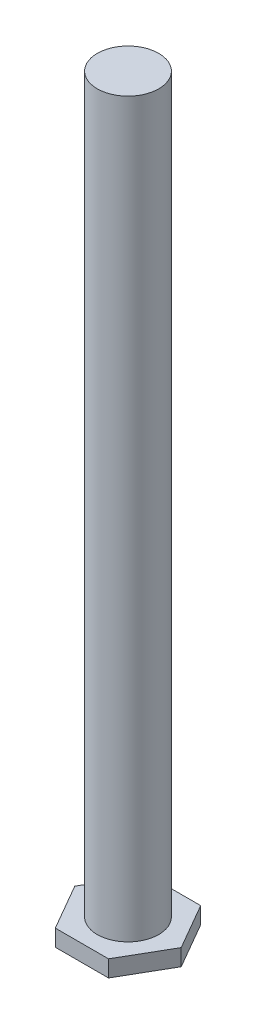
ISO-10303-21;
HEADER;
FILE_DESCRIPTION(('STEP AP214'),'2;1');
FILE_NAME('part.step','',(''),(''),'','','');
FILE_SCHEMA(('AUTOMOTIVE_DESIGN { 1 0 10303 214 1 1 1 1 }'));
ENDSEC;
DATA;
#1=APPLICATION_CONTEXT('core data for automotive mechanical design processes');
#2=APPLICATION_PROTOCOL_DEFINITION('international standard','automotive_design',2000,#1);
#3=PRODUCT_CONTEXT('',#1,'mechanical');
#4=PRODUCT('Part','Part','',(#3));
#5=PRODUCT_RELATED_PRODUCT_CATEGORY('part','',(#4));
#6=PRODUCT_DEFINITION_FORMATION('','',#4);
#7=PRODUCT_DEFINITION_CONTEXT('part definition',#1,'design');
#8=PRODUCT_DEFINITION('design','',#6,#7);
#9=PRODUCT_DEFINITION_SHAPE('','',#8);
#10=(LENGTH_UNIT() NAMED_UNIT(*) SI_UNIT(.MILLI.,.METRE.));
#11=(NAMED_UNIT(*) PLANE_ANGLE_UNIT() SI_UNIT($,.RADIAN.));
#12=(NAMED_UNIT(*) SI_UNIT($,.STERADIAN.) SOLID_ANGLE_UNIT());
#13=UNCERTAINTY_MEASURE_WITH_UNIT(LENGTH_MEASURE(1.E-05),#10,'distance_accuracy_value','');
#14=(GEOMETRIC_REPRESENTATION_CONTEXT(3) GLOBAL_UNCERTAINTY_ASSIGNED_CONTEXT((#13)) GLOBAL_UNIT_ASSIGNED_CONTEXT((#10,
#11,#12)) REPRESENTATION_CONTEXT('',''));
#15=CARTESIAN_POINT('',(0.,0.,0.));
#16=DIRECTION('',(0.,0.,1.));
#17=DIRECTION('',(1.,0.,0.));
#18=AXIS2_PLACEMENT_3D('',#15,#16,#17);
#19=CARTESIAN_POINT('',(-18.6032154166082,114.5794,1.21555100733523));
#20=DIRECTION('',(0.,-1.,0.));
#21=DIRECTION('',(0.,0.,-1.));
#22=AXIS2_PLACEMENT_3D('',#19,#20,#21);
#23=CYLINDRICAL_SURFACE('',#22,4.699);
#24=CARTESIAN_POINT('',(-18.6032154166082,114.5794,1.21555100733523));
#25=DIRECTION('',(0.,1.,0.));
#26=DIRECTION('',(0.,0.,1.));
#27=AXIS2_PLACEMENT_3D('',#24,#25,#26);
#28=CIRCLE('',#27,4.699);
#29=CARTESIAN_POINT('',(-18.6032154166082,114.5794,5.91455100733523));
#30=VERTEX_POINT('',#29);
#31=EDGE_CURVE('E11',#30,#30,#28,.T.);
#32=ORIENTED_EDGE('',*,*,#31,.F.);
#33=EDGE_LOOP('',(#32));
#34=FACE_BOUND('',#33,.T.);
#35=CARTESIAN_POINT('',(-18.6032154166082,2.54,1.21555100733523));
#36=DIRECTION('',(0.,1.,0.));
#37=DIRECTION('',(0.,0.,1.));
#38=AXIS2_PLACEMENT_3D('',#35,#36,#37);
#39=CIRCLE('',#38,4.699);
#40=CARTESIAN_POINT('',(-18.6032154166082,2.54,5.91455100733523));
#41=VERTEX_POINT('',#40);
#42=EDGE_CURVE('E54',#41,#41,#39,.T.);
#43=ORIENTED_EDGE('',*,*,#42,.T.);
#44=EDGE_LOOP('',(#43));
#45=FACE_BOUND('',#44,.T.);
#46=ADVANCED_FACE('F51',(#34,#45),#23,.T.);
#47=CARTESIAN_POINT('',(-18.6032154166082,114.5794,1.21555100733523));
#48=DIRECTION('',(0.,1.,0.));
#49=DIRECTION('',(0.,0.,1.));
#50=AXIS2_PLACEMENT_3D('',#47,#48,#49);
#51=PLANE('',#50);
#52=ORIENTED_EDGE('',*,*,#31,.T.);
#53=EDGE_LOOP('',(#52));
#54=FACE_BOUND('',#53,.T.);
#55=ADVANCED_FACE('F66',(#54),#51,.T.);
#56=CARTESIAN_POINT('',(-18.6032154166082,2.54,1.21555100733523));
#57=DIRECTION('',(0.,1.,0.));
#58=DIRECTION('',(0.,0.,1.));
#59=AXIS2_PLACEMENT_3D('',#56,#57,#58);
#60=PLANE('',#59);
#61=ORIENTED_EDGE('',*,*,#42,.F.);
#62=EDGE_LOOP('',(#61));
#63=FACE_BOUND('',#62,.T.);
#64=ADVANCED_FACE('F64',(#63),#60,.F.);
#65=CLOSED_SHELL('',(#46,#55,#64));
#66=MANIFOLD_SOLID_BREP('B2',#65);
#67=CARTESIAN_POINT('',(-14.5337620442251,2.54,8.26405100733511));
#68=DIRECTION('',(-0.866025403784441,0.,-0.499999999999995));
#69=DIRECTION('',(-0.499999999999995,0.,0.866025403784442));
#70=AXIS2_PLACEMENT_3D('',#67,#68,#69);
#71=PLANE('',#70);
#72=DIRECTION('',(0.499999999999995,0.,-0.866025403784442));
#73=VECTOR('',#72,1.);
#74=CARTESIAN_POINT('',(-14.5337620442251,0.,8.26405100733511));
#75=LINE('',#74,#73);
#76=CARTESIAN_POINT('',(-14.5337620442251,0.,8.26405100733511));
#77=VERTEX_POINT('',#76);
#78=CARTESIAN_POINT('',(-10.4643086718421,0.,1.2155510073352));
#79=VERTEX_POINT('',#78);
#80=EDGE_CURVE('E176',#77,#79,#75,.T.);
#81=ORIENTED_EDGE('',*,*,#80,.T.);
#82=DIRECTION('',(0.,-1.,0.));
#83=VECTOR('',#82,1.);
#84=CARTESIAN_POINT('',(-10.4643086718421,2.54,1.2155510073352));
#85=LINE('',#84,#83);
#86=CARTESIAN_POINT('',(-10.4643086718421,2.54,1.2155510073352));
#87=VERTEX_POINT('',#86);
#88=EDGE_CURVE('E49',#87,#79,#85,.T.);
#89=ORIENTED_EDGE('',*,*,#88,.F.);
#90=DIRECTION('',(0.499999999999995,0.,-0.866025403784442));
#91=VECTOR('',#90,1.);
#92=CARTESIAN_POINT('',(-14.5337620442251,2.54,8.26405100733511));
#93=LINE('',#92,#91);
#94=CARTESIAN_POINT('',(-14.5337620442251,2.54,8.26405100733511));
#95=VERTEX_POINT('',#94);
#96=EDGE_CURVE('E186',#95,#87,#93,.T.);
#97=ORIENTED_EDGE('',*,*,#96,.F.);
#98=DIRECTION('',(0.,-1.,0.));
#99=VECTOR('',#98,1.);
#100=CARTESIAN_POINT('',(-14.5337620442251,2.54,8.26405100733511));
#101=LINE('',#100,#99);
#102=EDGE_CURVE('E172',#95,#77,#101,.T.);
#103=ORIENTED_EDGE('',*,*,#102,.T.);
#104=EDGE_LOOP('',(#81,#89,#97,#103));
#105=FACE_BOUND('',#104,.T.);
#106=ADVANCED_FACE('F92',(#105),#71,.F.);
#107=CARTESIAN_POINT('',(-10.4643086718421,2.54,1.2155510073352));
#108=DIRECTION('',(-0.866025403784438,0.,0.500000000000001));
#109=DIRECTION('',(0.500000000000001,0.,0.866025403784438));
#110=AXIS2_PLACEMENT_3D('',#107,#108,#109);
#111=PLANE('',#110);
#112=DIRECTION('',(-0.500000000000001,0.,-0.866025403784438));
#113=VECTOR('',#112,1.);
#114=CARTESIAN_POINT('',(-10.4643086718421,0.,1.2155510073352));
#115=LINE('',#114,#113);
#116=CARTESIAN_POINT('',(-14.5337620442252,0.,-5.83294899266478));
#117=VERTEX_POINT('',#116);
#118=EDGE_CURVE('E179',#79,#117,#115,.T.);
#119=ORIENTED_EDGE('',*,*,#118,.T.);
#120=DIRECTION('',(0.,-1.,0.));
#121=VECTOR('',#120,1.);
#122=CARTESIAN_POINT('',(-14.5337620442252,2.54,-5.83294899266478));
#123=LINE('',#122,#121);
#124=CARTESIAN_POINT('',(-14.5337620442252,2.54,-5.83294899266478));
#125=VERTEX_POINT('',#124);
#126=EDGE_CURVE('E100',#125,#117,#123,.T.);
#127=ORIENTED_EDGE('',*,*,#126,.F.);
#128=DIRECTION('',(-0.500000000000001,0.,-0.866025403784438));
#129=VECTOR('',#128,1.);
#130=CARTESIAN_POINT('',(-10.4643086718421,2.54,1.2155510073352));
#131=LINE('',#130,#129);
#132=EDGE_CURVE('E145',#87,#125,#131,.T.);
#133=ORIENTED_EDGE('',*,*,#132,.F.);
#134=ORIENTED_EDGE('',*,*,#88,.T.);
#135=EDGE_LOOP('',(#119,#127,#133,#134));
#136=FACE_BOUND('',#135,.T.);
#137=ADVANCED_FACE('F210',(#136),#111,.F.);
#138=CARTESIAN_POINT('',(-14.5337620442252,2.54,-5.83294899266478));
#139=DIRECTION('',(0.,0.,1.));
#140=DIRECTION('',(1.,0.,0.));
#141=AXIS2_PLACEMENT_3D('',#138,#139,#140);
#142=PLANE('',#141);
#143=DIRECTION('',(-1.,0.,0.));
#144=VECTOR('',#143,1.);
#145=CARTESIAN_POINT('',(-14.5337620442252,0.,-5.83294899266478));
#146=LINE('',#145,#144);
#147=CARTESIAN_POINT('',(-22.6726687889913,0.,-5.83294899266475));
#148=VERTEX_POINT('',#147);
#149=EDGE_CURVE('E181',#117,#148,#146,.T.);
#150=ORIENTED_EDGE('',*,*,#149,.T.);
#151=DIRECTION('',(0.,-1.,0.));
#152=VECTOR('',#151,1.);
#153=CARTESIAN_POINT('',(-22.6726687889913,2.54,-5.83294899266475));
#154=LINE('',#153,#152);
#155=CARTESIAN_POINT('',(-22.6726687889913,2.54,-5.83294899266475));
#156=VERTEX_POINT('',#155);
#157=EDGE_CURVE('E167',#156,#148,#154,.T.);
#158=ORIENTED_EDGE('',*,*,#157,.F.);
#159=DIRECTION('',(-1.,0.,0.));
#160=VECTOR('',#159,1.);
#161=CARTESIAN_POINT('',(-14.5337620442252,2.54,-5.83294899266478));
#162=LINE('',#161,#160);
#163=EDGE_CURVE('E158',#125,#156,#162,.T.);
#164=ORIENTED_EDGE('',*,*,#163,.F.);
#165=ORIENTED_EDGE('',*,*,#126,.T.);
#166=EDGE_LOOP('',(#150,#158,#164,#165));
#167=FACE_BOUND('',#166,.T.);
#168=ADVANCED_FACE('F192',(#167),#142,.F.);
#169=CARTESIAN_POINT('',(-22.6726687889913,2.54,-5.83294899266475));
#170=DIRECTION('',(0.866025403784442,0.,0.499999999999995));
#171=DIRECTION('',(0.499999999999995,0.,-0.866025403784442));
#172=AXIS2_PLACEMENT_3D('',#169,#170,#171);
#173=PLANE('',#172);
#174=DIRECTION('',(-0.499999999999995,0.,0.866025403784441));
#175=VECTOR('',#174,1.);
#176=CARTESIAN_POINT('',(-22.6726687889913,0.,-5.83294899266475));
#177=LINE('',#176,#175);
#178=CARTESIAN_POINT('',(-26.7421221613744,0.,1.21555100733525));
#179=VERTEX_POINT('',#178);
#180=EDGE_CURVE('E166',#148,#179,#177,.T.);
#181=ORIENTED_EDGE('',*,*,#180,.T.);
#182=DIRECTION('',(0.,-1.,0.));
#183=VECTOR('',#182,1.);
#184=CARTESIAN_POINT('',(-26.7421221613744,2.54,1.21555100733525));
#185=LINE('',#184,#183);
#186=CARTESIAN_POINT('',(-26.7421221613744,2.54,1.21555100733525));
#187=VERTEX_POINT('',#186);
#188=EDGE_CURVE('E163',#187,#179,#185,.T.);
#189=ORIENTED_EDGE('',*,*,#188,.F.);
#190=DIRECTION('',(-0.499999999999995,0.,0.866025403784441));
#191=VECTOR('',#190,1.);
#192=CARTESIAN_POINT('',(-22.6726687889913,2.54,-5.83294899266475));
#193=LINE('',#192,#191);
#194=EDGE_CURVE('E152',#156,#187,#193,.T.);
#195=ORIENTED_EDGE('',*,*,#194,.F.);
#196=ORIENTED_EDGE('',*,*,#157,.T.);
#197=EDGE_LOOP('',(#181,#189,#195,#196));
#198=FACE_BOUND('',#197,.T.);
#199=ADVANCED_FACE('F164',(#198),#173,.F.);
#200=CARTESIAN_POINT('',(-26.7421221613744,2.54,1.21555100733525));
#201=DIRECTION('',(0.866025403784434,0.,-0.500000000000007));
#202=DIRECTION('',(-0.500000000000007,0.,-0.866025403784435));
#203=AXIS2_PLACEMENT_3D('',#200,#201,#202);
#204=PLANE('',#203);
#205=DIRECTION('',(0.500000000000007,0.,0.866025403784434));
#206=VECTOR('',#205,1.);
#207=CARTESIAN_POINT('',(-26.7421221613744,0.,1.21555100733525));
#208=LINE('',#207,#206);
#209=CARTESIAN_POINT('',(-22.6726687889912,0.,8.2640510073352));
#210=VERTEX_POINT('',#209);
#211=EDGE_CURVE('E131',#179,#210,#208,.T.);
#212=ORIENTED_EDGE('',*,*,#211,.T.);
#213=DIRECTION('',(0.,-1.,0.));
#214=VECTOR('',#213,1.);
#215=CARTESIAN_POINT('',(-22.6726687889912,2.54,8.2640510073352));
#216=LINE('',#215,#214);
#217=CARTESIAN_POINT('',(-22.6726687889912,2.54,8.2640510073352));
#218=VERTEX_POINT('',#217);
#219=EDGE_CURVE('E168',#218,#210,#216,.T.);
#220=ORIENTED_EDGE('',*,*,#219,.F.);
#221=DIRECTION('',(0.500000000000007,0.,0.866025403784434));
#222=VECTOR('',#221,1.);
#223=CARTESIAN_POINT('',(-26.7421221613744,2.54,1.21555100733525));
#224=LINE('',#223,#222);
#225=EDGE_CURVE('E156',#187,#218,#224,.T.);
#226=ORIENTED_EDGE('',*,*,#225,.F.);
#227=ORIENTED_EDGE('',*,*,#188,.T.);
#228=EDGE_LOOP('',(#212,#220,#226,#227));
#229=FACE_BOUND('',#228,.T.);
#230=ADVANCED_FACE('F170',(#229),#204,.F.);
#231=CARTESIAN_POINT('',(-22.6726687889912,2.54,8.2640510073352));
#232=DIRECTION('',(0.,0.,-1.));
#233=DIRECTION('',(-1.,0.,0.));
#234=AXIS2_PLACEMENT_3D('',#231,#232,#233);
#235=PLANE('',#234);
#236=DIRECTION('',(1.,0.,0.));
#237=VECTOR('',#236,1.);
#238=CARTESIAN_POINT('',(-22.6726687889912,0.,8.2640510073352));
#239=LINE('',#238,#237);
#240=EDGE_CURVE('E137',#210,#77,#239,.T.);
#241=ORIENTED_EDGE('',*,*,#240,.T.);
#242=ORIENTED_EDGE('',*,*,#102,.F.);
#243=DIRECTION('',(1.,0.,0.));
#244=VECTOR('',#243,1.);
#245=CARTESIAN_POINT('',(-22.6726687889912,2.54,8.2640510073352));
#246=LINE('',#245,#244);
#247=EDGE_CURVE('E108',#218,#95,#246,.T.);
#248=ORIENTED_EDGE('',*,*,#247,.F.);
#249=ORIENTED_EDGE('',*,*,#219,.T.);
#250=EDGE_LOOP('',(#241,#242,#248,#249));
#251=FACE_BOUND('',#250,.T.);
#252=ADVANCED_FACE('F199',(#251),#235,.F.);
#253=CARTESIAN_POINT('',(0.,2.54,0.));
#254=DIRECTION('',(0.,1.,0.));
#255=DIRECTION('',(0.,0.,1.));
#256=AXIS2_PLACEMENT_3D('',#253,#254,#255);
#257=PLANE('',#256);
#258=ORIENTED_EDGE('',*,*,#96,.T.);
#259=ORIENTED_EDGE('',*,*,#132,.T.);
#260=ORIENTED_EDGE('',*,*,#163,.T.);
#261=ORIENTED_EDGE('',*,*,#194,.T.);
#262=ORIENTED_EDGE('',*,*,#225,.T.);
#263=ORIENTED_EDGE('',*,*,#247,.T.);
#264=EDGE_LOOP('',(#258,#259,#260,#261,#262,#263));
#265=FACE_BOUND('',#264,.T.);
#266=ADVANCED_FACE('F154',(#265),#257,.T.);
#267=CARTESIAN_POINT('',(0.,0.,0.));
#268=DIRECTION('',(0.,1.,0.));
#269=DIRECTION('',(0.,0.,1.));
#270=AXIS2_PLACEMENT_3D('',#267,#268,#269);
#271=PLANE('',#270);
#272=ORIENTED_EDGE('',*,*,#80,.F.);
#273=ORIENTED_EDGE('',*,*,#240,.F.);
#274=ORIENTED_EDGE('',*,*,#211,.F.);
#275=ORIENTED_EDGE('',*,*,#180,.F.);
#276=ORIENTED_EDGE('',*,*,#149,.F.);
#277=ORIENTED_EDGE('',*,*,#118,.F.);
#278=EDGE_LOOP('',(#272,#273,#274,#275,#276,#277));
#279=FACE_BOUND('',#278,.T.);
#280=ADVANCED_FACE('F195',(#279),#271,.F.);
#281=CLOSED_SHELL('',(#106,#137,#168,#199,#230,#252,#266,#280));
#282=MANIFOLD_SOLID_BREP('B6',#281);
#283=ADVANCED_BREP_SHAPE_REPRESENTATION('',(#18,#66,#282),#14);
#284=SHAPE_DEFINITION_REPRESENTATION(#9,#283);
ENDSEC;
END-ISO-10303-21;
